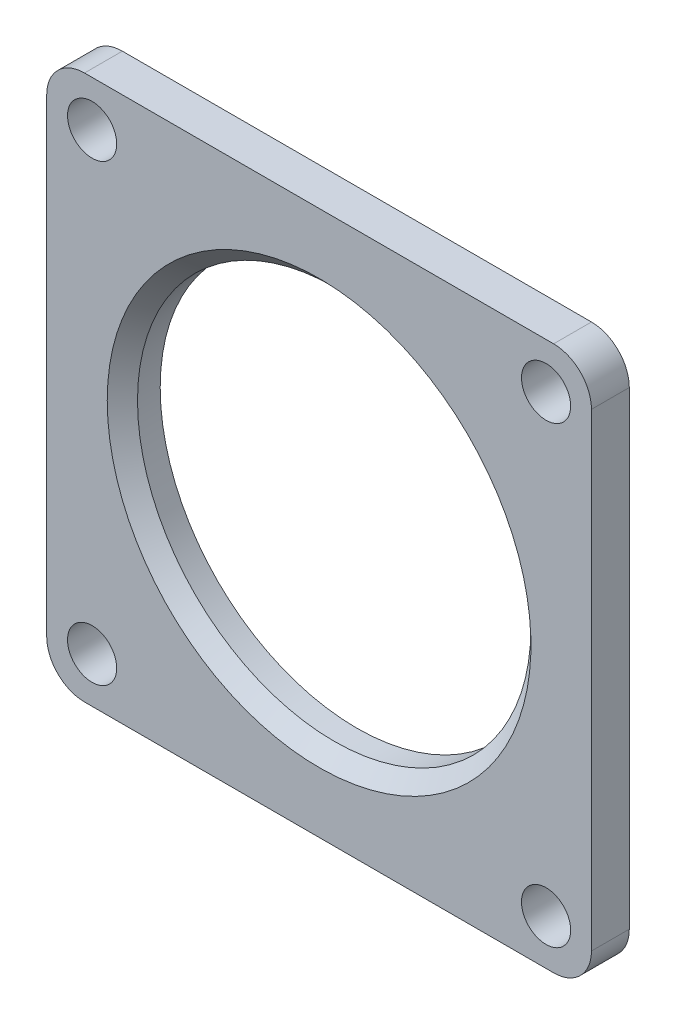
ISO-10303-21;
HEADER;
FILE_DESCRIPTION(('STEP AP214'),'2;1');
FILE_NAME('part.step','',(''),(''),'','','');
FILE_SCHEMA(('AUTOMOTIVE_DESIGN { 1 0 10303 214 1 1 1 1 }'));
ENDSEC;
DATA;
#1=APPLICATION_CONTEXT('core data for automotive mechanical design processes');
#2=APPLICATION_PROTOCOL_DEFINITION('international standard','automotive_design',2000,#1);
#3=PRODUCT_CONTEXT('',#1,'mechanical');
#4=PRODUCT('Part','Part','',(#3));
#5=PRODUCT_RELATED_PRODUCT_CATEGORY('part','',(#4));
#6=PRODUCT_DEFINITION_FORMATION('','',#4);
#7=PRODUCT_DEFINITION_CONTEXT('part definition',#1,'design');
#8=PRODUCT_DEFINITION('design','',#6,#7);
#9=PRODUCT_DEFINITION_SHAPE('','',#8);
#10=(LENGTH_UNIT() NAMED_UNIT(*) SI_UNIT(.MILLI.,.METRE.));
#11=(NAMED_UNIT(*) PLANE_ANGLE_UNIT() SI_UNIT($,.RADIAN.));
#12=(NAMED_UNIT(*) SI_UNIT($,.STERADIAN.) SOLID_ANGLE_UNIT());
#13=UNCERTAINTY_MEASURE_WITH_UNIT(LENGTH_MEASURE(1.E-05),#10,'distance_accuracy_value','');
#14=(GEOMETRIC_REPRESENTATION_CONTEXT(3) GLOBAL_UNCERTAINTY_ASSIGNED_CONTEXT((#13)) GLOBAL_UNIT_ASSIGNED_CONTEXT((#10,
#11,#12)) REPRESENTATION_CONTEXT('',''));
#15=CARTESIAN_POINT('',(0.,0.,0.));
#16=DIRECTION('',(0.,0.,1.));
#17=DIRECTION('',(1.,0.,0.));
#18=AXIS2_PLACEMENT_3D('',#15,#16,#17);
#19=CARTESIAN_POINT('',(63.8,36.,0.));
#20=DIRECTION('',(0.,0.,-1.));
#21=DIRECTION('',(-1.,0.,0.));
#22=AXIS2_PLACEMENT_3D('',#19,#20,#21);
#23=PLANE('',#22);
#24=CARTESIAN_POINT('',(36.,36.,0.));
#25=DIRECTION('',(0.,0.,1.));
#26=DIRECTION('',(1.,0.,0.));
#27=AXIS2_PLACEMENT_3D('',#24,#25,#26);
#28=CIRCLE('',#27,27.8);
#29=CARTESIAN_POINT('',(63.8,36.,0.));
#30=VERTEX_POINT('',#29);
#31=EDGE_CURVE('E227',#30,#30,#28,.T.);
#32=ORIENTED_EDGE('',*,*,#31,.F.);
#33=EDGE_LOOP('',(#32));
#34=FACE_BOUND('',#33,.T.);
#35=CARTESIAN_POINT('',(36.,36.,0.));
#36=DIRECTION('',(0.,0.,1.));
#37=DIRECTION('',(1.,0.,0.));
#38=AXIS2_PLACEMENT_3D('',#35,#36,#37);
#39=CIRCLE('',#38,26.);
#40=CARTESIAN_POINT('',(62.,36.,0.));
#41=VERTEX_POINT('',#40);
#42=EDGE_CURVE('E351',#41,#41,#39,.T.);
#43=ORIENTED_EDGE('',*,*,#42,.T.);
#44=EDGE_LOOP('',(#43));
#45=FACE_BOUND('',#44,.T.);
#46=ADVANCED_FACE('F47',(#34,#45),#23,.T.);
#47=CARTESIAN_POINT('',(0.,0.,0.));
#48=DIRECTION('',(0.,0.,-1.));
#49=DIRECTION('',(-1.,0.,0.));
#50=AXIS2_PLACEMENT_3D('',#47,#48,#49);
#51=PLANE('',#50);
#52=CARTESIAN_POINT('',(66.,6.,0.));
#53=DIRECTION('',(0.,0.,1.));
#54=DIRECTION('',(1.,0.,0.));
#55=AXIS2_PLACEMENT_3D('',#52,#53,#54);
#56=CIRCLE('',#55,3.25000000000002);
#57=CARTESIAN_POINT('',(69.25,6.,0.));
#58=VERTEX_POINT('',#57);
#59=EDGE_CURVE('E345',#58,#58,#56,.T.);
#60=ORIENTED_EDGE('',*,*,#59,.T.);
#61=EDGE_LOOP('',(#60));
#62=FACE_BOUND('',#61,.T.);
#63=CARTESIAN_POINT('',(6.,6.,0.));
#64=DIRECTION('',(0.,0.,1.));
#65=DIRECTION('',(1.,0.,0.));
#66=AXIS2_PLACEMENT_3D('',#63,#64,#65);
#67=CIRCLE('',#66,3.25000000000002);
#68=CARTESIAN_POINT('',(9.25000000000002,6.,0.));
#69=VERTEX_POINT('',#68);
#70=EDGE_CURVE('E339',#69,#69,#67,.T.);
#71=ORIENTED_EDGE('',*,*,#70,.T.);
#72=EDGE_LOOP('',(#71));
#73=FACE_BOUND('',#72,.T.);
#74=CARTESIAN_POINT('',(6.,66.,0.));
#75=DIRECTION('',(0.,0.,1.));
#76=DIRECTION('',(1.,0.,0.));
#77=AXIS2_PLACEMENT_3D('',#74,#75,#76);
#78=CIRCLE('',#77,3.25000000000002);
#79=CARTESIAN_POINT('',(9.25000000000002,66.,0.));
#80=VERTEX_POINT('',#79);
#81=EDGE_CURVE('E320',#80,#80,#78,.T.);
#82=ORIENTED_EDGE('',*,*,#81,.T.);
#83=EDGE_LOOP('',(#82));
#84=FACE_BOUND('',#83,.T.);
#85=DIRECTION('',(0.,1.,0.));
#86=VECTOR('',#85,1.);
#87=CARTESIAN_POINT('',(0.,0.,0.));
#88=LINE('',#87,#86);
#89=CARTESIAN_POINT('',(0.,5.,0.));
#90=VERTEX_POINT('',#89);
#91=CARTESIAN_POINT('',(0.,67.,0.));
#92=VERTEX_POINT('',#91);
#93=EDGE_CURVE('E119',#90,#92,#88,.T.);
#94=ORIENTED_EDGE('',*,*,#93,.T.);
#95=CARTESIAN_POINT('',(5.00000000000004,67.,0.));
#96=DIRECTION('',(0.,0.,-1.));
#97=DIRECTION('',(-1.,0.,0.));
#98=AXIS2_PLACEMENT_3D('',#95,#96,#97);
#99=CIRCLE('',#98,5.);
#100=CARTESIAN_POINT('',(5.00000000000004,72.,0.));
#101=VERTEX_POINT('',#100);
#102=EDGE_CURVE('E158',#92,#101,#99,.T.);
#103=ORIENTED_EDGE('',*,*,#102,.T.);
#104=DIRECTION('',(1.,0.,0.));
#105=VECTOR('',#104,1.);
#106=CARTESIAN_POINT('',(0.,72.,0.));
#107=LINE('',#106,#105);
#108=CARTESIAN_POINT('',(67.,72.,0.));
#109=VERTEX_POINT('',#108);
#110=EDGE_CURVE('E138',#101,#109,#107,.T.);
#111=ORIENTED_EDGE('',*,*,#110,.T.);
#112=CARTESIAN_POINT('',(67.,67.,0.));
#113=DIRECTION('',(0.,0.,-1.));
#114=DIRECTION('',(-1.,0.,0.));
#115=AXIS2_PLACEMENT_3D('',#112,#113,#114);
#116=CIRCLE('',#115,5.);
#117=CARTESIAN_POINT('',(72.,67.,0.));
#118=VERTEX_POINT('',#117);
#119=EDGE_CURVE('E126',#109,#118,#116,.T.);
#120=ORIENTED_EDGE('',*,*,#119,.T.);
#121=DIRECTION('',(0.,-1.,0.));
#122=VECTOR('',#121,1.);
#123=CARTESIAN_POINT('',(72.,72.,0.));
#124=LINE('',#123,#122);
#125=CARTESIAN_POINT('',(72.,4.99999999999999,0.));
#126=VERTEX_POINT('',#125);
#127=EDGE_CURVE('E194',#118,#126,#124,.T.);
#128=ORIENTED_EDGE('',*,*,#127,.T.);
#129=CARTESIAN_POINT('',(67.,4.99999999999999,0.));
#130=DIRECTION('',(0.,0.,-1.));
#131=DIRECTION('',(-1.,0.,0.));
#132=AXIS2_PLACEMENT_3D('',#129,#130,#131);
#133=CIRCLE('',#132,5.);
#134=CARTESIAN_POINT('',(67.,0.,0.));
#135=VERTEX_POINT('',#134);
#136=EDGE_CURVE('E127',#126,#135,#133,.T.);
#137=ORIENTED_EDGE('',*,*,#136,.T.);
#138=DIRECTION('',(-1.,0.,0.));
#139=VECTOR('',#138,1.);
#140=CARTESIAN_POINT('',(72.,0.,0.));
#141=LINE('',#140,#139);
#142=CARTESIAN_POINT('',(5.00000000000005,0.,0.));
#143=VERTEX_POINT('',#142);
#144=EDGE_CURVE('E121',#135,#143,#141,.T.);
#145=ORIENTED_EDGE('',*,*,#144,.T.);
#146=CARTESIAN_POINT('',(5.00000000000005,5.,0.));
#147=DIRECTION('',(0.,0.,-1.));
#148=DIRECTION('',(-1.,0.,0.));
#149=AXIS2_PLACEMENT_3D('',#146,#147,#148);
#150=CIRCLE('',#149,5.);
#151=EDGE_CURVE('E115',#143,#90,#150,.T.);
#152=ORIENTED_EDGE('',*,*,#151,.T.);
#153=EDGE_LOOP('',(#94,#103,#111,#120,#128,#137,#145,#152));
#154=FACE_BOUND('',#153,.T.);
#155=CARTESIAN_POINT('',(36.,36.,0.));
#156=DIRECTION('',(0.,0.,-1.));
#157=DIRECTION('',(-1.,0.,0.));
#158=AXIS2_PLACEMENT_3D('',#155,#156,#157);
#159=CIRCLE('',#158,31.3);
#160=CARTESIAN_POINT('',(4.69999999999998,36.,0.));
#161=VERTEX_POINT('',#160);
#162=EDGE_CURVE('E221',#161,#161,#159,.T.);
#163=ORIENTED_EDGE('',*,*,#162,.F.);
#164=EDGE_LOOP('',(#163));
#165=FACE_BOUND('',#164,.T.);
#166=CARTESIAN_POINT('',(66.,66.,0.));
#167=DIRECTION('',(0.,0.,1.));
#168=DIRECTION('',(1.,0.,0.));
#169=AXIS2_PLACEMENT_3D('',#166,#167,#168);
#170=CIRCLE('',#169,3.25000000000002);
#171=CARTESIAN_POINT('',(69.25,66.,0.));
#172=VERTEX_POINT('',#171);
#173=EDGE_CURVE('E319',#172,#172,#170,.T.);
#174=ORIENTED_EDGE('',*,*,#173,.T.);
#175=EDGE_LOOP('',(#174));
#176=FACE_BOUND('',#175,.T.);
#177=ADVANCED_FACE('F117',(#62,#73,#84,#154,#165,#176),#51,.T.);
#178=CARTESIAN_POINT('',(72.,0.,5.));
#179=DIRECTION('',(0.,-1.,0.));
#180=DIRECTION('',(1.,0.,0.));
#181=AXIS2_PLACEMENT_3D('',#178,#179,#180);
#182=PLANE('',#181);
#183=DIRECTION('',(-1.,0.,0.));
#184=VECTOR('',#183,1.);
#185=CARTESIAN_POINT('',(72.,0.,5.));
#186=LINE('',#185,#184);
#187=CARTESIAN_POINT('',(67.,0.,5.));
#188=VERTEX_POINT('',#187);
#189=CARTESIAN_POINT('',(5.00000000000005,0.,5.));
#190=VERTEX_POINT('',#189);
#191=EDGE_CURVE('E188',#188,#190,#186,.T.);
#192=ORIENTED_EDGE('',*,*,#191,.T.);
#193=DIRECTION('',(0.,0.,-1.));
#194=VECTOR('',#193,1.);
#195=CARTESIAN_POINT('',(5.00000000000005,0.,5.));
#196=LINE('',#195,#194);
#197=EDGE_CURVE('E11',#190,#143,#196,.T.);
#198=ORIENTED_EDGE('',*,*,#197,.T.);
#199=ORIENTED_EDGE('',*,*,#144,.F.);
#200=DIRECTION('',(0.,0.,-1.));
#201=VECTOR('',#200,1.);
#202=CARTESIAN_POINT('',(67.,0.,5.));
#203=LINE('',#202,#201);
#204=EDGE_CURVE('E56',#135,#188,#203,.F.);
#205=ORIENTED_EDGE('',*,*,#204,.T.);
#206=EDGE_LOOP('',(#192,#198,#199,#205));
#207=FACE_BOUND('',#206,.T.);
#208=ADVANCED_FACE('F187',(#207),#182,.T.);
#209=CARTESIAN_POINT('',(72.,72.,5.));
#210=DIRECTION('',(1.,0.,0.));
#211=DIRECTION('',(0.,0.,-1.));
#212=AXIS2_PLACEMENT_3D('',#209,#210,#211);
#213=PLANE('',#212);
#214=ORIENTED_EDGE('',*,*,#127,.F.);
#215=DIRECTION('',(0.,0.,-1.));
#216=VECTOR('',#215,1.);
#217=CARTESIAN_POINT('',(72.,67.,5.));
#218=LINE('',#217,#216);
#219=CARTESIAN_POINT('',(72.,67.,5.));
#220=VERTEX_POINT('',#219);
#221=EDGE_CURVE('E70',#118,#220,#218,.F.);
#222=ORIENTED_EDGE('',*,*,#221,.T.);
#223=DIRECTION('',(0.,-1.,0.));
#224=VECTOR('',#223,1.);
#225=CARTESIAN_POINT('',(72.,72.,5.));
#226=LINE('',#225,#224);
#227=CARTESIAN_POINT('',(72.,4.99999999999999,5.));
#228=VERTEX_POINT('',#227);
#229=EDGE_CURVE('E199',#220,#228,#226,.T.);
#230=ORIENTED_EDGE('',*,*,#229,.T.);
#231=DIRECTION('',(0.,0.,-1.));
#232=VECTOR('',#231,1.);
#233=CARTESIAN_POINT('',(72.,4.99999999999999,5.));
#234=LINE('',#233,#232);
#235=EDGE_CURVE('E178',#228,#126,#234,.T.);
#236=ORIENTED_EDGE('',*,*,#235,.T.);
#237=EDGE_LOOP('',(#214,#222,#230,#236));
#238=FACE_BOUND('',#237,.T.);
#239=ADVANCED_FACE('F198',(#238),#213,.T.);
#240=CARTESIAN_POINT('',(0.,72.,5.));
#241=DIRECTION('',(0.,1.,0.));
#242=DIRECTION('',(-1.,0.,0.));
#243=AXIS2_PLACEMENT_3D('',#240,#241,#242);
#244=PLANE('',#243);
#245=ORIENTED_EDGE('',*,*,#110,.F.);
#246=DIRECTION('',(0.,0.,-1.));
#247=VECTOR('',#246,1.);
#248=CARTESIAN_POINT('',(5.00000000000004,72.,5.));
#249=LINE('',#248,#247);
#250=CARTESIAN_POINT('',(5.00000000000004,72.,5.));
#251=VERTEX_POINT('',#250);
#252=EDGE_CURVE('E165',#101,#251,#249,.F.);
#253=ORIENTED_EDGE('',*,*,#252,.T.);
#254=DIRECTION('',(1.,0.,0.));
#255=VECTOR('',#254,1.);
#256=CARTESIAN_POINT('',(0.,72.,5.));
#257=LINE('',#256,#255);
#258=CARTESIAN_POINT('',(67.,72.,5.));
#259=VERTEX_POINT('',#258);
#260=EDGE_CURVE('E210',#251,#259,#257,.T.);
#261=ORIENTED_EDGE('',*,*,#260,.T.);
#262=DIRECTION('',(0.,0.,-1.));
#263=VECTOR('',#262,1.);
#264=CARTESIAN_POINT('',(67.,72.,5.));
#265=LINE('',#264,#263);
#266=EDGE_CURVE('E161',#259,#109,#265,.T.);
#267=ORIENTED_EDGE('',*,*,#266,.T.);
#268=EDGE_LOOP('',(#245,#253,#261,#267));
#269=FACE_BOUND('',#268,.T.);
#270=ADVANCED_FACE('F237',(#269),#244,.T.);
#271=CARTESIAN_POINT('',(0.,0.,5.));
#272=DIRECTION('',(-1.,0.,0.));
#273=DIRECTION('',(0.,-1.,0.));
#274=AXIS2_PLACEMENT_3D('',#271,#272,#273);
#275=PLANE('',#274);
#276=DIRECTION('',(0.,1.,0.));
#277=VECTOR('',#276,1.);
#278=CARTESIAN_POINT('',(0.,0.,5.));
#279=LINE('',#278,#277);
#280=CARTESIAN_POINT('',(0.,5.,5.));
#281=VERTEX_POINT('',#280);
#282=CARTESIAN_POINT('',(0.,67.,5.));
#283=VERTEX_POINT('',#282);
#284=EDGE_CURVE('E193',#281,#283,#279,.T.);
#285=ORIENTED_EDGE('',*,*,#284,.T.);
#286=DIRECTION('',(0.,0.,-1.));
#287=VECTOR('',#286,1.);
#288=CARTESIAN_POINT('',(0.,67.,5.));
#289=LINE('',#288,#287);
#290=EDGE_CURVE('E136',#283,#92,#289,.T.);
#291=ORIENTED_EDGE('',*,*,#290,.T.);
#292=ORIENTED_EDGE('',*,*,#93,.F.);
#293=DIRECTION('',(0.,0.,-1.));
#294=VECTOR('',#293,1.);
#295=CARTESIAN_POINT('',(0.,5.,5.));
#296=LINE('',#295,#294);
#297=EDGE_CURVE('E133',#90,#281,#296,.F.);
#298=ORIENTED_EDGE('',*,*,#297,.T.);
#299=EDGE_LOOP('',(#285,#291,#292,#298));
#300=FACE_BOUND('',#299,.T.);
#301=ADVANCED_FACE('F132',(#300),#275,.T.);
#302=CARTESIAN_POINT('',(0.,0.,5.));
#303=DIRECTION('',(0.,0.,-1.));
#304=DIRECTION('',(-1.,0.,0.));
#305=AXIS2_PLACEMENT_3D('',#302,#303,#304);
#306=PLANE('',#305);
#307=CARTESIAN_POINT('',(36.,36.,5.));
#308=DIRECTION('',(0.,0.,-1.));
#309=DIRECTION('',(-1.,0.,0.));
#310=AXIS2_PLACEMENT_3D('',#307,#308,#309);
#311=CIRCLE('',#310,28.);
#312=CARTESIAN_POINT('',(7.99999999999995,36.,5.));
#313=VERTEX_POINT('',#312);
#314=EDGE_CURVE('E144',#313,#313,#311,.T.);
#315=ORIENTED_EDGE('',*,*,#314,.T.);
#316=EDGE_LOOP('',(#315));
#317=FACE_BOUND('',#316,.T.);
#318=CARTESIAN_POINT('',(66.,6.,5.));
#319=DIRECTION('',(0.,0.,1.));
#320=DIRECTION('',(1.,0.,0.));
#321=AXIS2_PLACEMENT_3D('',#318,#319,#320);
#322=CIRCLE('',#321,3.25000000000002);
#323=CARTESIAN_POINT('',(69.25,6.,5.));
#324=VERTEX_POINT('',#323);
#325=EDGE_CURVE('E305',#324,#324,#322,.T.);
#326=ORIENTED_EDGE('',*,*,#325,.F.);
#327=EDGE_LOOP('',(#326));
#328=FACE_BOUND('',#327,.T.);
#329=CARTESIAN_POINT('',(6.,6.,5.));
#330=DIRECTION('',(0.,0.,1.));
#331=DIRECTION('',(1.,0.,0.));
#332=AXIS2_PLACEMENT_3D('',#329,#330,#331);
#333=CIRCLE('',#332,3.25000000000002);
#334=CARTESIAN_POINT('',(9.25000000000002,6.,5.));
#335=VERTEX_POINT('',#334);
#336=EDGE_CURVE('E309',#335,#335,#333,.T.);
#337=ORIENTED_EDGE('',*,*,#336,.F.);
#338=EDGE_LOOP('',(#337));
#339=FACE_BOUND('',#338,.T.);
#340=CARTESIAN_POINT('',(6.,66.,5.));
#341=DIRECTION('',(0.,0.,1.));
#342=DIRECTION('',(1.,0.,0.));
#343=AXIS2_PLACEMENT_3D('',#340,#341,#342);
#344=CIRCLE('',#343,3.25000000000002);
#345=CARTESIAN_POINT('',(9.25000000000002,66.,5.));
#346=VERTEX_POINT('',#345);
#347=EDGE_CURVE('E313',#346,#346,#344,.T.);
#348=ORIENTED_EDGE('',*,*,#347,.F.);
#349=EDGE_LOOP('',(#348));
#350=FACE_BOUND('',#349,.T.);
#351=CARTESIAN_POINT('',(66.,66.,5.));
#352=DIRECTION('',(0.,0.,1.));
#353=DIRECTION('',(1.,0.,0.));
#354=AXIS2_PLACEMENT_3D('',#351,#352,#353);
#355=CIRCLE('',#354,3.25000000000002);
#356=CARTESIAN_POINT('',(69.25,66.,5.));
#357=VERTEX_POINT('',#356);
#358=EDGE_CURVE('E316',#357,#357,#355,.T.);
#359=ORIENTED_EDGE('',*,*,#358,.F.);
#360=EDGE_LOOP('',(#359));
#361=FACE_BOUND('',#360,.T.);
#362=ORIENTED_EDGE('',*,*,#260,.F.);
#363=CARTESIAN_POINT('',(5.00000000000004,67.,5.));
#364=DIRECTION('',(0.,0.,-1.));
#365=DIRECTION('',(-1.,0.,0.));
#366=AXIS2_PLACEMENT_3D('',#363,#364,#365);
#367=CIRCLE('',#366,5.);
#368=EDGE_CURVE('E175',#251,#283,#367,.F.);
#369=ORIENTED_EDGE('',*,*,#368,.T.);
#370=ORIENTED_EDGE('',*,*,#284,.F.);
#371=CARTESIAN_POINT('',(5.00000000000005,5.,5.));
#372=DIRECTION('',(0.,0.,-1.));
#373=DIRECTION('',(-1.,0.,0.));
#374=AXIS2_PLACEMENT_3D('',#371,#372,#373);
#375=CIRCLE('',#374,5.);
#376=EDGE_CURVE('E142',#281,#190,#375,.F.);
#377=ORIENTED_EDGE('',*,*,#376,.T.);
#378=ORIENTED_EDGE('',*,*,#191,.F.);
#379=CARTESIAN_POINT('',(67.,4.99999999999999,5.));
#380=DIRECTION('',(0.,0.,-1.));
#381=DIRECTION('',(-1.,0.,0.));
#382=AXIS2_PLACEMENT_3D('',#379,#380,#381);
#383=CIRCLE('',#382,5.);
#384=EDGE_CURVE('E63',#188,#228,#383,.F.);
#385=ORIENTED_EDGE('',*,*,#384,.T.);
#386=ORIENTED_EDGE('',*,*,#229,.F.);
#387=CARTESIAN_POINT('',(67.,67.,5.));
#388=DIRECTION('',(0.,0.,-1.));
#389=DIRECTION('',(-1.,0.,0.));
#390=AXIS2_PLACEMENT_3D('',#387,#388,#389);
#391=CIRCLE('',#390,5.);
#392=EDGE_CURVE('E172',#220,#259,#391,.F.);
#393=ORIENTED_EDGE('',*,*,#392,.T.);
#394=EDGE_LOOP('',(#362,#369,#370,#377,#378,#385,#386,#393));
#395=FACE_BOUND('',#394,.T.);
#396=ADVANCED_FACE('F191',(#317,#328,#339,#350,#361,#395),#306,.F.);
#397=CARTESIAN_POINT('',(36.,36.,2.25));
#398=DIRECTION('',(0.,0.,1.));
#399=DIRECTION('',(1.,0.,0.));
#400=AXIS2_PLACEMENT_3D('',#397,#398,#399);
#401=PLANE('',#400);
#402=CARTESIAN_POINT('',(36.,36.,2.25));
#403=DIRECTION('',(0.,0.,1.));
#404=DIRECTION('',(1.,0.,0.));
#405=AXIS2_PLACEMENT_3D('',#402,#403,#404);
#406=CIRCLE('',#405,27.8);
#407=CARTESIAN_POINT('',(63.8,36.,2.25));
#408=VERTEX_POINT('',#407);
#409=EDGE_CURVE('E325',#408,#408,#406,.T.);
#410=ORIENTED_EDGE('',*,*,#409,.T.);
#411=EDGE_LOOP('',(#410));
#412=FACE_BOUND('',#411,.T.);
#413=CARTESIAN_POINT('',(36.,36.,2.25));
#414=DIRECTION('',(0.,0.,-1.));
#415=DIRECTION('',(-1.,0.,0.));
#416=AXIS2_PLACEMENT_3D('',#413,#414,#415);
#417=CIRCLE('',#416,31.3);
#418=CARTESIAN_POINT('',(4.69999999999998,36.,2.25));
#419=VERTEX_POINT('',#418);
#420=EDGE_CURVE('E218',#419,#419,#417,.T.);
#421=ORIENTED_EDGE('',*,*,#420,.T.);
#422=EDGE_LOOP('',(#421));
#423=FACE_BOUND('',#422,.T.);
#424=ADVANCED_FACE('F273',(#412,#423),#401,.F.);
#425=CARTESIAN_POINT('',(36.,36.,0.));
#426=DIRECTION('',(0.,0.,-1.));
#427=DIRECTION('',(-1.,0.,0.));
#428=AXIS2_PLACEMENT_3D('',#425,#426,#427);
#429=CYLINDRICAL_SURFACE('',#428,31.3);
#430=ORIENTED_EDGE('',*,*,#420,.F.);
#431=EDGE_LOOP('',(#430));
#432=FACE_BOUND('',#431,.T.);
#433=ORIENTED_EDGE('',*,*,#162,.T.);
#434=EDGE_LOOP('',(#433));
#435=FACE_BOUND('',#434,.T.);
#436=ADVANCED_FACE('F269',(#432,#435),#429,.F.);
#437=CARTESIAN_POINT('',(36.,36.,0.));
#438=DIRECTION('',(0.,0.,1.));
#439=DIRECTION('',(1.,0.,0.));
#440=AXIS2_PLACEMENT_3D('',#437,#438,#439);
#441=CYLINDRICAL_SURFACE('',#440,27.8);
#442=ORIENTED_EDGE('',*,*,#31,.T.);
#443=EDGE_LOOP('',(#442));
#444=FACE_BOUND('',#443,.T.);
#445=ORIENTED_EDGE('',*,*,#409,.F.);
#446=EDGE_LOOP('',(#445));
#447=FACE_BOUND('',#446,.T.);
#448=ADVANCED_FACE('F266',(#444,#447),#441,.T.);
#449=CARTESIAN_POINT('',(66.,66.,5.));
#450=DIRECTION('',(0.,0.,1.));
#451=DIRECTION('',(1.,0.,0.));
#452=AXIS2_PLACEMENT_3D('',#449,#450,#451);
#453=CYLINDRICAL_SURFACE('',#452,3.25000000000002);
#454=ORIENTED_EDGE('',*,*,#173,.F.);
#455=EDGE_LOOP('',(#454));
#456=FACE_BOUND('',#455,.T.);
#457=ORIENTED_EDGE('',*,*,#358,.T.);
#458=EDGE_LOOP('',(#457));
#459=FACE_BOUND('',#458,.T.);
#460=ADVANCED_FACE('F264',(#456,#459),#453,.F.);
#461=CARTESIAN_POINT('',(6.,66.,5.));
#462=DIRECTION('',(0.,0.,1.));
#463=DIRECTION('',(1.,0.,0.));
#464=AXIS2_PLACEMENT_3D('',#461,#462,#463);
#465=CYLINDRICAL_SURFACE('',#464,3.25000000000002);
#466=ORIENTED_EDGE('',*,*,#81,.F.);
#467=EDGE_LOOP('',(#466));
#468=FACE_BOUND('',#467,.T.);
#469=ORIENTED_EDGE('',*,*,#347,.T.);
#470=EDGE_LOOP('',(#469));
#471=FACE_BOUND('',#470,.T.);
#472=ADVANCED_FACE('F363',(#468,#471),#465,.F.);
#473=CARTESIAN_POINT('',(6.,6.,5.));
#474=DIRECTION('',(0.,0.,1.));
#475=DIRECTION('',(1.,0.,0.));
#476=AXIS2_PLACEMENT_3D('',#473,#474,#475);
#477=CYLINDRICAL_SURFACE('',#476,3.25000000000002);
#478=ORIENTED_EDGE('',*,*,#70,.F.);
#479=EDGE_LOOP('',(#478));
#480=FACE_BOUND('',#479,.T.);
#481=ORIENTED_EDGE('',*,*,#336,.T.);
#482=EDGE_LOOP('',(#481));
#483=FACE_BOUND('',#482,.T.);
#484=ADVANCED_FACE('F357',(#480,#483),#477,.F.);
#485=CARTESIAN_POINT('',(66.,6.,5.));
#486=DIRECTION('',(0.,0.,1.));
#487=DIRECTION('',(1.,0.,0.));
#488=AXIS2_PLACEMENT_3D('',#485,#486,#487);
#489=CYLINDRICAL_SURFACE('',#488,3.25000000000002);
#490=ORIENTED_EDGE('',*,*,#59,.F.);
#491=EDGE_LOOP('',(#490));
#492=FACE_BOUND('',#491,.T.);
#493=ORIENTED_EDGE('',*,*,#325,.T.);
#494=EDGE_LOOP('',(#493));
#495=FACE_BOUND('',#494,.T.);
#496=ADVANCED_FACE('F297',(#492,#495),#489,.F.);
#497=CARTESIAN_POINT('',(36.,36.,5.));
#498=DIRECTION('',(0.,0.,1.));
#499=DIRECTION('',(1.,0.,0.));
#500=AXIS2_PLACEMENT_3D('',#497,#498,#499);
#501=CYLINDRICAL_SURFACE('',#500,26.);
#502=CARTESIAN_POINT('',(36.,36.,2.99999999999998));
#503=DIRECTION('',(0.,0.,-1.));
#504=DIRECTION('',(-1.,0.,0.));
#505=AXIS2_PLACEMENT_3D('',#502,#503,#504);
#506=CIRCLE('',#505,26.);
#507=CARTESIAN_POINT('',(9.99999999999998,36.,2.99999999999998));
#508=VERTEX_POINT('',#507);
#509=EDGE_CURVE('E150',#508,#508,#506,.F.);
#510=ORIENTED_EDGE('',*,*,#509,.T.);
#511=EDGE_LOOP('',(#510));
#512=FACE_BOUND('',#511,.T.);
#513=ORIENTED_EDGE('',*,*,#42,.F.);
#514=EDGE_LOOP('',(#513));
#515=FACE_BOUND('',#514,.T.);
#516=ADVANCED_FACE('F293',(#512,#515),#501,.F.);
#517=CARTESIAN_POINT('',(36.,36.,2.99999999999998));
#518=DIRECTION('',(0.,0.,1.));
#519=DIRECTION('',(1.,0.,0.));
#520=AXIS2_PLACEMENT_3D('',#517,#518,#519);
#521=CONICAL_SURFACE('',#520,26.,0.785398163397453);
#522=ORIENTED_EDGE('',*,*,#314,.F.);
#523=EDGE_LOOP('',(#522));
#524=FACE_BOUND('',#523,.T.);
#525=ORIENTED_EDGE('',*,*,#509,.F.);
#526=EDGE_LOOP('',(#525));
#527=FACE_BOUND('',#526,.T.);
#528=ADVANCED_FACE('F248',(#524,#527),#521,.F.);
#529=CARTESIAN_POINT('',(5.00000000000004,67.,5.));
#530=DIRECTION('',(0.,0.,-1.));
#531=DIRECTION('',(-1.,0.,0.));
#532=AXIS2_PLACEMENT_3D('',#529,#530,#531);
#533=CYLINDRICAL_SURFACE('',#532,5.);
#534=ORIENTED_EDGE('',*,*,#368,.F.);
#535=ORIENTED_EDGE('',*,*,#252,.F.);
#536=ORIENTED_EDGE('',*,*,#102,.F.);
#537=ORIENTED_EDGE('',*,*,#290,.F.);
#538=EDGE_LOOP('',(#534,#535,#536,#537));
#539=FACE_BOUND('',#538,.T.);
#540=ADVANCED_FACE('F233',(#539),#533,.T.);
#541=CARTESIAN_POINT('',(67.,67.,5.));
#542=DIRECTION('',(0.,0.,-1.));
#543=DIRECTION('',(-1.,0.,0.));
#544=AXIS2_PLACEMENT_3D('',#541,#542,#543);
#545=CYLINDRICAL_SURFACE('',#544,5.);
#546=ORIENTED_EDGE('',*,*,#392,.F.);
#547=ORIENTED_EDGE('',*,*,#221,.F.);
#548=ORIENTED_EDGE('',*,*,#119,.F.);
#549=ORIENTED_EDGE('',*,*,#266,.F.);
#550=EDGE_LOOP('',(#546,#547,#548,#549));
#551=FACE_BOUND('',#550,.T.);
#552=ADVANCED_FACE('F241',(#551),#545,.T.);
#553=CARTESIAN_POINT('',(5.00000000000005,5.,5.));
#554=DIRECTION('',(0.,0.,-1.));
#555=DIRECTION('',(-1.,0.,0.));
#556=AXIS2_PLACEMENT_3D('',#553,#554,#555);
#557=CYLINDRICAL_SURFACE('',#556,5.);
#558=ORIENTED_EDGE('',*,*,#376,.F.);
#559=ORIENTED_EDGE('',*,*,#297,.F.);
#560=ORIENTED_EDGE('',*,*,#151,.F.);
#561=ORIENTED_EDGE('',*,*,#197,.F.);
#562=EDGE_LOOP('',(#558,#559,#560,#561));
#563=FACE_BOUND('',#562,.T.);
#564=ADVANCED_FACE('F141',(#563),#557,.T.);
#565=CARTESIAN_POINT('',(67.,4.99999999999999,5.));
#566=DIRECTION('',(0.,0.,-1.));
#567=DIRECTION('',(-1.,0.,0.));
#568=AXIS2_PLACEMENT_3D('',#565,#566,#567);
#569=CYLINDRICAL_SURFACE('',#568,5.);
#570=ORIENTED_EDGE('',*,*,#384,.F.);
#571=ORIENTED_EDGE('',*,*,#204,.F.);
#572=ORIENTED_EDGE('',*,*,#136,.F.);
#573=ORIENTED_EDGE('',*,*,#235,.F.);
#574=EDGE_LOOP('',(#570,#571,#572,#573));
#575=FACE_BOUND('',#574,.T.);
#576=ADVANCED_FACE('F49',(#575),#569,.T.);
#577=CLOSED_SHELL('',(#46,#177,#208,#239,#270,#301,#396,#424,#436,#448,#460,#472,#484,#496,#516,
#528,#540,#552,#564,#576));
#578=MANIFOLD_SOLID_BREP('B2',#577);
#579=ADVANCED_BREP_SHAPE_REPRESENTATION('',(#18,#578),#14);
#580=SHAPE_DEFINITION_REPRESENTATION(#9,#579);
ENDSEC;
END-ISO-10303-21;
